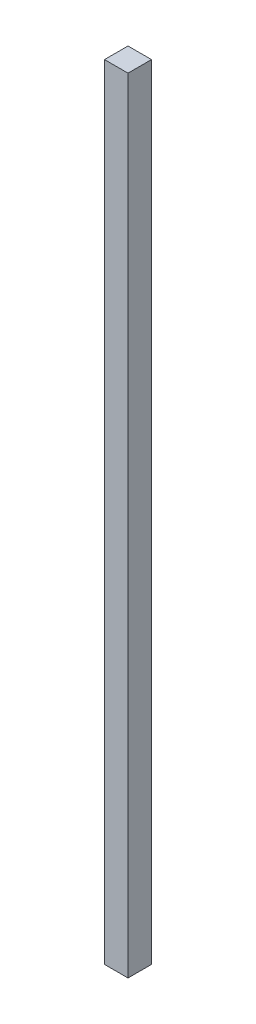
ISO-10303-21;
HEADER;
FILE_DESCRIPTION(('STEP AP214'),'2;1');
FILE_NAME('part.step','',(''),(''),'','','');
FILE_SCHEMA(('AUTOMOTIVE_DESIGN { 1 0 10303 214 1 1 1 1 }'));
ENDSEC;
DATA;
#1=APPLICATION_CONTEXT('core data for automotive mechanical design processes');
#2=APPLICATION_PROTOCOL_DEFINITION('international standard','automotive_design',2000,#1);
#3=PRODUCT_CONTEXT('',#1,'mechanical');
#4=PRODUCT('Part','Part','',(#3));
#5=PRODUCT_RELATED_PRODUCT_CATEGORY('part','',(#4));
#6=PRODUCT_DEFINITION_FORMATION('','',#4);
#7=PRODUCT_DEFINITION_CONTEXT('part definition',#1,'design');
#8=PRODUCT_DEFINITION('design','',#6,#7);
#9=PRODUCT_DEFINITION_SHAPE('','',#8);
#10=(LENGTH_UNIT() NAMED_UNIT(*) SI_UNIT(.MILLI.,.METRE.));
#11=(NAMED_UNIT(*) PLANE_ANGLE_UNIT() SI_UNIT($,.RADIAN.));
#12=(NAMED_UNIT(*) SI_UNIT($,.STERADIAN.) SOLID_ANGLE_UNIT());
#13=UNCERTAINTY_MEASURE_WITH_UNIT(LENGTH_MEASURE(1.E-05),#10,'distance_accuracy_value','');
#14=(GEOMETRIC_REPRESENTATION_CONTEXT(3) GLOBAL_UNCERTAINTY_ASSIGNED_CONTEXT((#13)) GLOBAL_UNIT_ASSIGNED_CONTEXT((#10,
#11,#12)) REPRESENTATION_CONTEXT('',''));
#15=CARTESIAN_POINT('',(0.,0.,0.));
#16=DIRECTION('',(0.,0.,1.));
#17=DIRECTION('',(1.,0.,0.));
#18=AXIS2_PLACEMENT_3D('',#15,#16,#17);
#19=CARTESIAN_POINT('',(15.,1000.,15.));
#20=DIRECTION('',(-1.,0.,0.));
#21=DIRECTION('',(0.,0.,1.));
#22=AXIS2_PLACEMENT_3D('',#19,#20,#21);
#23=PLANE('',#22);
#24=DIRECTION('',(0.,0.,-1.));
#25=VECTOR('',#24,1.);
#26=CARTESIAN_POINT('',(15.,0.,15.));
#27=LINE('',#26,#25);
#28=CARTESIAN_POINT('',(15.,0.,15.));
#29=VERTEX_POINT('',#28);
#30=CARTESIAN_POINT('',(15.,0.,-15.));
#31=VERTEX_POINT('',#30);
#32=EDGE_CURVE('E113',#29,#31,#27,.T.);
#33=ORIENTED_EDGE('',*,*,#32,.T.);
#34=DIRECTION('',(0.,-1.,0.));
#35=VECTOR('',#34,1.);
#36=CARTESIAN_POINT('',(15.,1000.,-15.));
#37=LINE('',#36,#35);
#38=CARTESIAN_POINT('',(15.,1000.,-15.));
#39=VERTEX_POINT('',#38);
#40=EDGE_CURVE('E11',#39,#31,#37,.T.);
#41=ORIENTED_EDGE('',*,*,#40,.F.);
#42=DIRECTION('',(0.,0.,-1.));
#43=VECTOR('',#42,1.);
#44=CARTESIAN_POINT('',(15.,1000.,15.));
#45=LINE('',#44,#43);
#46=CARTESIAN_POINT('',(15.,1000.,15.));
#47=VERTEX_POINT('',#46);
#48=EDGE_CURVE('E97',#47,#39,#45,.T.);
#49=ORIENTED_EDGE('',*,*,#48,.F.);
#50=DIRECTION('',(0.,-1.,0.));
#51=VECTOR('',#50,1.);
#52=CARTESIAN_POINT('',(15.,1000.,15.));
#53=LINE('',#52,#51);
#54=EDGE_CURVE('E109',#47,#29,#53,.T.);
#55=ORIENTED_EDGE('',*,*,#54,.T.);
#56=EDGE_LOOP('',(#33,#41,#49,#55));
#57=FACE_BOUND('',#56,.T.);
#58=ADVANCED_FACE('F45',(#57),#23,.F.);
#59=CARTESIAN_POINT('',(-15.,1000.,-15.));
#60=DIRECTION('',(0.,0.,1.));
#61=DIRECTION('',(1.,0.,0.));
#62=AXIS2_PLACEMENT_3D('',#59,#60,#61);
#63=PLANE('',#62);
#64=DIRECTION('',(-1.,0.,0.));
#65=VECTOR('',#64,1.);
#66=CARTESIAN_POINT('',(-15.,0.,-15.));
#67=LINE('',#66,#65);
#68=CARTESIAN_POINT('',(-15.,0.,-15.));
#69=VERTEX_POINT('',#68);
#70=EDGE_CURVE('E102',#31,#69,#67,.T.);
#71=ORIENTED_EDGE('',*,*,#70,.T.);
#72=DIRECTION('',(0.,-1.,0.));
#73=VECTOR('',#72,1.);
#74=CARTESIAN_POINT('',(-15.,1000.,-15.));
#75=LINE('',#74,#73);
#76=CARTESIAN_POINT('',(-15.,1000.,-15.));
#77=VERTEX_POINT('',#76);
#78=EDGE_CURVE('E54',#77,#69,#75,.T.);
#79=ORIENTED_EDGE('',*,*,#78,.F.);
#80=DIRECTION('',(-1.,0.,0.));
#81=VECTOR('',#80,1.);
#82=CARTESIAN_POINT('',(-15.,1000.,-15.));
#83=LINE('',#82,#81);
#84=EDGE_CURVE('E92',#39,#77,#83,.T.);
#85=ORIENTED_EDGE('',*,*,#84,.F.);
#86=ORIENTED_EDGE('',*,*,#40,.T.);
#87=EDGE_LOOP('',(#71,#79,#85,#86));
#88=FACE_BOUND('',#87,.T.);
#89=ADVANCED_FACE('F101',(#88),#63,.F.);
#90=CARTESIAN_POINT('',(-15.,1000.,15.));
#91=DIRECTION('',(1.,0.,0.));
#92=DIRECTION('',(0.,0.,-1.));
#93=AXIS2_PLACEMENT_3D('',#90,#91,#92);
#94=PLANE('',#93);
#95=DIRECTION('',(0.,0.,1.));
#96=VECTOR('',#95,1.);
#97=CARTESIAN_POINT('',(-15.,0.,15.));
#98=LINE('',#97,#96);
#99=CARTESIAN_POINT('',(-15.,0.,15.));
#100=VERTEX_POINT('',#99);
#101=EDGE_CURVE('E79',#69,#100,#98,.T.);
#102=ORIENTED_EDGE('',*,*,#101,.T.);
#103=DIRECTION('',(0.,-1.,0.));
#104=VECTOR('',#103,1.);
#105=CARTESIAN_POINT('',(-15.,1000.,15.));
#106=LINE('',#105,#104);
#107=CARTESIAN_POINT('',(-15.,1000.,15.));
#108=VERTEX_POINT('',#107);
#109=EDGE_CURVE('E104',#108,#100,#106,.T.);
#110=ORIENTED_EDGE('',*,*,#109,.F.);
#111=DIRECTION('',(0.,0.,1.));
#112=VECTOR('',#111,1.);
#113=CARTESIAN_POINT('',(-15.,1000.,15.));
#114=LINE('',#113,#112);
#115=EDGE_CURVE('E95',#77,#108,#114,.T.);
#116=ORIENTED_EDGE('',*,*,#115,.F.);
#117=ORIENTED_EDGE('',*,*,#78,.T.);
#118=EDGE_LOOP('',(#102,#110,#116,#117));
#119=FACE_BOUND('',#118,.T.);
#120=ADVANCED_FACE('F105',(#119),#94,.F.);
#121=CARTESIAN_POINT('',(-15.,1000.,15.));
#122=DIRECTION('',(0.,0.,-1.));
#123=DIRECTION('',(-1.,0.,0.));
#124=AXIS2_PLACEMENT_3D('',#121,#122,#123);
#125=PLANE('',#124);
#126=DIRECTION('',(1.,0.,0.));
#127=VECTOR('',#126,1.);
#128=CARTESIAN_POINT('',(-15.,0.,15.));
#129=LINE('',#128,#127);
#130=EDGE_CURVE('E85',#100,#29,#129,.T.);
#131=ORIENTED_EDGE('',*,*,#130,.T.);
#132=ORIENTED_EDGE('',*,*,#54,.F.);
#133=DIRECTION('',(1.,0.,0.));
#134=VECTOR('',#133,1.);
#135=CARTESIAN_POINT('',(-15.,1000.,15.));
#136=LINE('',#135,#134);
#137=EDGE_CURVE('E62',#108,#47,#136,.T.);
#138=ORIENTED_EDGE('',*,*,#137,.F.);
#139=ORIENTED_EDGE('',*,*,#109,.T.);
#140=EDGE_LOOP('',(#131,#132,#138,#139));
#141=FACE_BOUND('',#140,.T.);
#142=ADVANCED_FACE('F126',(#141),#125,.F.);
#143=CARTESIAN_POINT('',(0.,1000.,0.));
#144=DIRECTION('',(0.,-1.,0.));
#145=DIRECTION('',(0.,0.,-1.));
#146=AXIS2_PLACEMENT_3D('',#143,#144,#145);
#147=PLANE('',#146);
#148=ORIENTED_EDGE('',*,*,#48,.T.);
#149=ORIENTED_EDGE('',*,*,#84,.T.);
#150=ORIENTED_EDGE('',*,*,#115,.T.);
#151=ORIENTED_EDGE('',*,*,#137,.T.);
#152=EDGE_LOOP('',(#148,#149,#150,#151));
#153=FACE_BOUND('',#152,.T.);
#154=ADVANCED_FACE('F93',(#153),#147,.F.);
#155=CARTESIAN_POINT('',(0.,0.,0.));
#156=DIRECTION('',(0.,-1.,0.));
#157=DIRECTION('',(0.,0.,-1.));
#158=AXIS2_PLACEMENT_3D('',#155,#156,#157);
#159=PLANE('',#158);
#160=ORIENTED_EDGE('',*,*,#32,.F.);
#161=ORIENTED_EDGE('',*,*,#130,.F.);
#162=ORIENTED_EDGE('',*,*,#101,.F.);
#163=ORIENTED_EDGE('',*,*,#70,.F.);
#164=EDGE_LOOP('',(#160,#161,#162,#163));
#165=FACE_BOUND('',#164,.T.);
#166=ADVANCED_FACE('F129',(#165),#159,.T.);
#167=CLOSED_SHELL('',(#58,#89,#120,#142,#154,#166));
#168=MANIFOLD_SOLID_BREP('B2',#167);
#169=ADVANCED_BREP_SHAPE_REPRESENTATION('',(#18,#168),#14);
#170=SHAPE_DEFINITION_REPRESENTATION(#9,#169);
ENDSEC;
END-ISO-10303-21;
